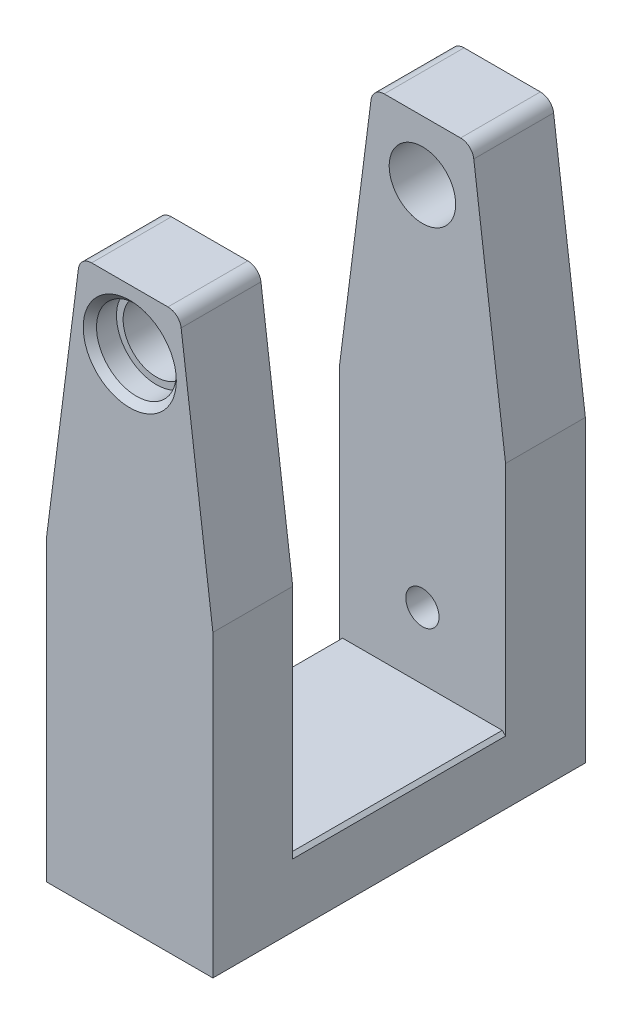
ISO-10303-21;
HEADER;
FILE_DESCRIPTION(('STEP AP214'),'2;1');
FILE_NAME('part.step','',(''),(''),'','','');
FILE_SCHEMA(('AUTOMOTIVE_DESIGN { 1 0 10303 214 1 1 1 1 }'));
ENDSEC;
DATA;
#1=APPLICATION_CONTEXT('core data for automotive mechanical design processes');
#2=APPLICATION_PROTOCOL_DEFINITION('international standard','automotive_design',2000,#1);
#3=PRODUCT_CONTEXT('',#1,'mechanical');
#4=PRODUCT('Part','Part','',(#3));
#5=PRODUCT_RELATED_PRODUCT_CATEGORY('part','',(#4));
#6=PRODUCT_DEFINITION_FORMATION('','',#4);
#7=PRODUCT_DEFINITION_CONTEXT('part definition',#1,'design');
#8=PRODUCT_DEFINITION('design','',#6,#7);
#9=PRODUCT_DEFINITION_SHAPE('','',#8);
#10=(LENGTH_UNIT() NAMED_UNIT(*) SI_UNIT(.MILLI.,.METRE.));
#11=(NAMED_UNIT(*) PLANE_ANGLE_UNIT() SI_UNIT($,.RADIAN.));
#12=(NAMED_UNIT(*) SI_UNIT($,.STERADIAN.) SOLID_ANGLE_UNIT());
#13=UNCERTAINTY_MEASURE_WITH_UNIT(LENGTH_MEASURE(1.E-05),#10,'distance_accuracy_value','');
#14=(GEOMETRIC_REPRESENTATION_CONTEXT(3) GLOBAL_UNCERTAINTY_ASSIGNED_CONTEXT((#13)) GLOBAL_UNIT_ASSIGNED_CONTEXT((#10,
#11,#12)) REPRESENTATION_CONTEXT('',''));
#15=CARTESIAN_POINT('',(0.,0.,0.));
#16=DIRECTION('',(0.,0.,1.));
#17=DIRECTION('',(1.,0.,0.));
#18=AXIS2_PLACEMENT_3D('',#15,#16,#17);
#19=CARTESIAN_POINT('',(7.49999999999998,84.,28.));
#20=DIRECTION('',(-0.99188166468585,-0.127164315985366,0.));
#21=DIRECTION('',(0.127164315985366,-0.991881664685851,0.));
#22=AXIS2_PLACEMENT_3D('',#19,#20,#21);
#23=PLANE('',#22);
#24=DIRECTION('',(-0.127164315985366,0.991881664685851,0.));
#25=VECTOR('',#24,1.);
#26=CARTESIAN_POINT('',(7.49999999999998,84.,16.));
#27=LINE('',#26,#25);
#28=CARTESIAN_POINT('',(12.5,45.,16.));
#29=VERTEX_POINT('',#28);
#30=CARTESIAN_POINT('',(7.72380402154219,82.2543286319708,16.));
#31=VERTEX_POINT('',#30);
#32=EDGE_CURVE('E278',#29,#31,#27,.T.);
#33=ORIENTED_EDGE('',*,*,#32,.T.);
#34=DIRECTION('',(0.,0.,-1.));
#35=VECTOR('',#34,1.);
#36=CARTESIAN_POINT('',(7.72380402154219,82.2543286319708,28.));
#37=LINE('',#36,#35);
#38=CARTESIAN_POINT('',(7.72380402154219,82.2543286319708,28.));
#39=VERTEX_POINT('',#38);
#40=EDGE_CURVE('E232',#31,#39,#37,.F.);
#41=ORIENTED_EDGE('',*,*,#40,.T.);
#42=DIRECTION('',(-0.127164315985366,0.991881664685851,0.));
#43=VECTOR('',#42,1.);
#44=CARTESIAN_POINT('',(7.49999999999998,84.,28.));
#45=LINE('',#44,#43);
#46=CARTESIAN_POINT('',(12.5,45.,28.));
#47=VERTEX_POINT('',#46);
#48=EDGE_CURVE('E293',#47,#39,#45,.T.);
#49=ORIENTED_EDGE('',*,*,#48,.F.);
#50=DIRECTION('',(0.,0.,-1.));
#51=VECTOR('',#50,1.);
#52=CARTESIAN_POINT('',(12.5,45.,28.));
#53=LINE('',#52,#51);
#54=EDGE_CURVE('E181',#47,#29,#53,.T.);
#55=ORIENTED_EDGE('',*,*,#54,.T.);
#56=EDGE_LOOP('',(#33,#41,#49,#55));
#57=FACE_BOUND('',#56,.T.);
#58=ADVANCED_FACE('F34',(#57),#23,.F.);
#59=CARTESIAN_POINT('',(7.49999999999998,84.,28.));
#60=DIRECTION('',(0.,-1.,0.));
#61=DIRECTION('',(0.,0.,-1.));
#62=AXIS2_PLACEMENT_3D('',#59,#60,#61);
#63=PLANE('',#62);
#64=DIRECTION('',(-1.,0.,0.));
#65=VECTOR('',#64,1.);
#66=CARTESIAN_POINT('',(7.49999999999998,84.,28.));
#67=LINE('',#66,#65);
#68=CARTESIAN_POINT('',(5.74004069217049,84.,28.));
#69=VERTEX_POINT('',#68);
#70=CARTESIAN_POINT('',(-5.74004069217054,84.,28.));
#71=VERTEX_POINT('',#70);
#72=EDGE_CURVE('E296',#69,#71,#67,.T.);
#73=ORIENTED_EDGE('',*,*,#72,.F.);
#74=DIRECTION('',(0.,0.,-1.));
#75=VECTOR('',#74,1.);
#76=CARTESIAN_POINT('',(5.74004069217049,84.,28.));
#77=LINE('',#76,#75);
#78=CARTESIAN_POINT('',(5.74004069217049,84.,16.));
#79=VERTEX_POINT('',#78);
#80=EDGE_CURVE('E225',#69,#79,#77,.T.);
#81=ORIENTED_EDGE('',*,*,#80,.T.);
#82=DIRECTION('',(1.,0.,0.));
#83=VECTOR('',#82,1.);
#84=CARTESIAN_POINT('',(-43.5,84.,16.));
#85=LINE('',#84,#83);
#86=CARTESIAN_POINT('',(-5.74004069217053,84.,16.));
#87=VERTEX_POINT('',#86);
#88=EDGE_CURVE('E330',#87,#79,#85,.T.);
#89=ORIENTED_EDGE('',*,*,#88,.F.);
#90=DIRECTION('',(0.,0.,-1.));
#91=VECTOR('',#90,1.);
#92=CARTESIAN_POINT('',(-5.74004069217054,84.,28.));
#93=LINE('',#92,#91);
#94=EDGE_CURVE('E223',#87,#71,#93,.F.);
#95=ORIENTED_EDGE('',*,*,#94,.T.);
#96=EDGE_LOOP('',(#73,#81,#89,#95));
#97=FACE_BOUND('',#96,.T.);
#98=ADVANCED_FACE('F335',(#97),#63,.F.);
#99=CARTESIAN_POINT('',(-7.50000000000002,84.,28.));
#100=DIRECTION('',(0.991881664685851,-0.127164315985365,0.));
#101=DIRECTION('',(0.127164315985365,0.991881664685851,0.));
#102=AXIS2_PLACEMENT_3D('',#99,#100,#101);
#103=PLANE('',#102);
#104=DIRECTION('',(-0.127164315985365,-0.991881664685851,0.));
#105=VECTOR('',#104,1.);
#106=CARTESIAN_POINT('',(-7.50000000000002,84.,28.));
#107=LINE('',#106,#105);
#108=CARTESIAN_POINT('',(-7.72380402154224,82.2543286319707,28.));
#109=VERTEX_POINT('',#108);
#110=CARTESIAN_POINT('',(-12.5,45.,28.));
#111=VERTEX_POINT('',#110);
#112=EDGE_CURVE('E299',#109,#111,#107,.T.);
#113=ORIENTED_EDGE('',*,*,#112,.F.);
#114=DIRECTION('',(0.,0.,-1.));
#115=VECTOR('',#114,1.);
#116=CARTESIAN_POINT('',(-7.72380402154224,82.2543286319707,28.));
#117=LINE('',#116,#115);
#118=CARTESIAN_POINT('',(-7.72380402154224,82.2543286319707,16.));
#119=VERTEX_POINT('',#118);
#120=EDGE_CURVE('E238',#109,#119,#117,.T.);
#121=ORIENTED_EDGE('',*,*,#120,.T.);
#122=DIRECTION('',(-0.127164315985365,-0.991881664685851,0.));
#123=VECTOR('',#122,1.);
#124=CARTESIAN_POINT('',(-7.50000000000002,84.,16.));
#125=LINE('',#124,#123);
#126=CARTESIAN_POINT('',(-12.5,45.,16.));
#127=VERTEX_POINT('',#126);
#128=EDGE_CURVE('E198',#119,#127,#125,.T.);
#129=ORIENTED_EDGE('',*,*,#128,.T.);
#130=DIRECTION('',(0.,0.,-1.));
#131=VECTOR('',#130,1.);
#132=CARTESIAN_POINT('',(-12.5,45.,28.));
#133=LINE('',#132,#131);
#134=EDGE_CURVE('E182',#111,#127,#133,.T.);
#135=ORIENTED_EDGE('',*,*,#134,.F.);
#136=EDGE_LOOP('',(#113,#121,#129,#135));
#137=FACE_BOUND('',#136,.T.);
#138=ADVANCED_FACE('F328',(#137),#103,.F.);
#139=CARTESIAN_POINT('',(-12.5,0.,28.));
#140=DIRECTION('',(1.,0.,0.));
#141=DIRECTION('',(0.,0.,-1.));
#142=AXIS2_PLACEMENT_3D('',#139,#140,#141);
#143=PLANE('',#142);
#144=DIRECTION('',(0.,0.,-1.));
#145=VECTOR('',#144,1.);
#146=CARTESIAN_POINT('',(-12.5,9.5,28.));
#147=LINE('',#146,#145);
#148=CARTESIAN_POINT('',(-12.5,9.5,16.));
#149=VERTEX_POINT('',#148);
#150=CARTESIAN_POINT('',(-12.5,9.5,-16.));
#151=VERTEX_POINT('',#150);
#152=EDGE_CURVE('E244',#149,#151,#147,.T.);
#153=ORIENTED_EDGE('',*,*,#152,.T.);
#154=DIRECTION('',(0.,1.,0.));
#155=VECTOR('',#154,1.);
#156=CARTESIAN_POINT('',(-12.5,0.,-16.));
#157=LINE('',#156,#155);
#158=CARTESIAN_POINT('',(-12.5,45.,-16.));
#159=VERTEX_POINT('',#158);
#160=EDGE_CURVE('E169',#151,#159,#157,.T.);
#161=ORIENTED_EDGE('',*,*,#160,.T.);
#162=CARTESIAN_POINT('',(-12.5,45.,-28.));
#163=VERTEX_POINT('',#162);
#164=EDGE_CURVE('E187',#159,#163,#133,.T.);
#165=ORIENTED_EDGE('',*,*,#164,.T.);
#166=DIRECTION('',(0.,-1.,0.));
#167=VECTOR('',#166,1.);
#168=CARTESIAN_POINT('',(-12.5,0.,-28.));
#169=LINE('',#168,#167);
#170=CARTESIAN_POINT('',(-12.5,0.,-28.));
#171=VERTEX_POINT('',#170);
#172=EDGE_CURVE('E281',#163,#171,#169,.T.);
#173=ORIENTED_EDGE('',*,*,#172,.T.);
#174=DIRECTION('',(0.,0.,-1.));
#175=VECTOR('',#174,1.);
#176=CARTESIAN_POINT('',(-12.5,0.,28.));
#177=LINE('',#176,#175);
#178=CARTESIAN_POINT('',(-12.5,0.,28.));
#179=VERTEX_POINT('',#178);
#180=EDGE_CURVE('E192',#179,#171,#177,.T.);
#181=ORIENTED_EDGE('',*,*,#180,.F.);
#182=DIRECTION('',(0.,-1.,0.));
#183=VECTOR('',#182,1.);
#184=CARTESIAN_POINT('',(-12.5,0.,28.));
#185=LINE('',#184,#183);
#186=EDGE_CURVE('E285',#111,#179,#185,.T.);
#187=ORIENTED_EDGE('',*,*,#186,.F.);
#188=ORIENTED_EDGE('',*,*,#134,.T.);
#189=DIRECTION('',(0.,-1.,0.));
#190=VECTOR('',#189,1.);
#191=CARTESIAN_POINT('',(-12.5,0.,16.));
#192=LINE('',#191,#190);
#193=EDGE_CURVE('E168',#127,#149,#192,.T.);
#194=ORIENTED_EDGE('',*,*,#193,.T.);
#195=EDGE_LOOP('',(#153,#161,#165,#173,#181,#187,#188,#194));
#196=FACE_BOUND('',#195,.T.);
#197=ADVANCED_FACE('F273',(#196),#143,.F.);
#198=CARTESIAN_POINT('',(12.5,0.,28.));
#199=DIRECTION('',(0.,1.,0.));
#200=DIRECTION('',(0.,0.,1.));
#201=AXIS2_PLACEMENT_3D('',#198,#199,#200);
#202=PLANE('',#201);
#203=DIRECTION('',(1.,0.,0.));
#204=VECTOR('',#203,1.);
#205=CARTESIAN_POINT('',(12.5,0.,-28.));
#206=LINE('',#205,#204);
#207=CARTESIAN_POINT('',(12.5,0.,-28.));
#208=VERTEX_POINT('',#207);
#209=EDGE_CURVE('E303',#171,#208,#206,.T.);
#210=ORIENTED_EDGE('',*,*,#209,.T.);
#211=DIRECTION('',(0.,0.,-1.));
#212=VECTOR('',#211,1.);
#213=CARTESIAN_POINT('',(12.5,0.,28.));
#214=LINE('',#213,#212);
#215=CARTESIAN_POINT('',(12.5,0.,28.));
#216=VERTEX_POINT('',#215);
#217=EDGE_CURVE('E185',#216,#208,#214,.T.);
#218=ORIENTED_EDGE('',*,*,#217,.F.);
#219=DIRECTION('',(1.,0.,0.));
#220=VECTOR('',#219,1.);
#221=CARTESIAN_POINT('',(12.5,0.,28.));
#222=LINE('',#221,#220);
#223=EDGE_CURVE('E288',#179,#216,#222,.T.);
#224=ORIENTED_EDGE('',*,*,#223,.F.);
#225=ORIENTED_EDGE('',*,*,#180,.T.);
#226=EDGE_LOOP('',(#210,#218,#224,#225));
#227=FACE_BOUND('',#226,.T.);
#228=ADVANCED_FACE('F321',(#227),#202,.F.);
#229=CARTESIAN_POINT('',(12.5,0.,28.));
#230=DIRECTION('',(-1.,0.,0.));
#231=DIRECTION('',(0.,0.,1.));
#232=AXIS2_PLACEMENT_3D('',#229,#230,#231);
#233=PLANE('',#232);
#234=DIRECTION('',(0.,1.,0.));
#235=VECTOR('',#234,1.);
#236=CARTESIAN_POINT('',(12.5,84.,-16.));
#237=LINE('',#236,#235);
#238=CARTESIAN_POINT('',(12.5,9.5,-16.));
#239=VERTEX_POINT('',#238);
#240=CARTESIAN_POINT('',(12.5,45.,-16.));
#241=VERTEX_POINT('',#240);
#242=EDGE_CURVE('E50',#239,#241,#237,.T.);
#243=ORIENTED_EDGE('',*,*,#242,.F.);
#244=DIRECTION('',(0.,0.,1.));
#245=VECTOR('',#244,1.);
#246=CARTESIAN_POINT('',(12.5,9.5,28.));
#247=LINE('',#246,#245);
#248=CARTESIAN_POINT('',(12.5,9.49999999999999,16.));
#249=VERTEX_POINT('',#248);
#250=EDGE_CURVE('E252',#239,#249,#247,.T.);
#251=ORIENTED_EDGE('',*,*,#250,.T.);
#252=DIRECTION('',(0.,-1.,0.));
#253=VECTOR('',#252,1.);
#254=CARTESIAN_POINT('',(12.5,84.,16.));
#255=LINE('',#254,#253);
#256=EDGE_CURVE('E57',#29,#249,#255,.T.);
#257=ORIENTED_EDGE('',*,*,#256,.F.);
#258=ORIENTED_EDGE('',*,*,#54,.F.);
#259=DIRECTION('',(0.,1.,0.));
#260=VECTOR('',#259,1.);
#261=CARTESIAN_POINT('',(12.5,0.,28.));
#262=LINE('',#261,#260);
#263=EDGE_CURVE('E291',#216,#47,#262,.T.);
#264=ORIENTED_EDGE('',*,*,#263,.F.);
#265=ORIENTED_EDGE('',*,*,#217,.T.);
#266=DIRECTION('',(0.,1.,0.));
#267=VECTOR('',#266,1.);
#268=CARTESIAN_POINT('',(12.5,0.,-28.));
#269=LINE('',#268,#267);
#270=CARTESIAN_POINT('',(12.5,45.,-28.));
#271=VERTEX_POINT('',#270);
#272=EDGE_CURVE('E179',#208,#271,#269,.T.);
#273=ORIENTED_EDGE('',*,*,#272,.T.);
#274=EDGE_CURVE('E162',#241,#271,#53,.T.);
#275=ORIENTED_EDGE('',*,*,#274,.F.);
#276=EDGE_LOOP('',(#243,#251,#257,#258,#264,#265,#273,#275));
#277=FACE_BOUND('',#276,.T.);
#278=ADVANCED_FACE('F176',(#277),#233,.F.);
#279=DIRECTION('',(-0.127164315985366,0.991881664685851,0.));
#280=VECTOR('',#279,1.);
#281=CARTESIAN_POINT('',(7.49999999999998,84.,-28.));
#282=LINE('',#281,#280);
#283=CARTESIAN_POINT('',(7.72380402154219,82.2543286319708,-28.));
#284=VERTEX_POINT('',#283);
#285=EDGE_CURVE('E306',#271,#284,#282,.T.);
#286=ORIENTED_EDGE('',*,*,#285,.T.);
#287=DIRECTION('',(0.,0.,-1.));
#288=VECTOR('',#287,1.);
#289=CARTESIAN_POINT('',(7.72380402154219,82.2543286319708,28.));
#290=LINE('',#289,#288);
#291=CARTESIAN_POINT('',(7.72380402154219,82.2543286319708,-16.));
#292=VERTEX_POINT('',#291);
#293=EDGE_CURVE('E165',#284,#292,#290,.F.);
#294=ORIENTED_EDGE('',*,*,#293,.T.);
#295=DIRECTION('',(0.127164315985366,-0.991881664685851,0.));
#296=VECTOR('',#295,1.);
#297=CARTESIAN_POINT('',(7.49999999999998,84.,-16.));
#298=LINE('',#297,#296);
#299=EDGE_CURVE('E159',#292,#241,#298,.T.);
#300=ORIENTED_EDGE('',*,*,#299,.T.);
#301=ORIENTED_EDGE('',*,*,#274,.T.);
#302=EDGE_LOOP('',(#286,#294,#300,#301));
#303=FACE_BOUND('',#302,.T.);
#304=ADVANCED_FACE('F161',(#303),#23,.F.);
#305=DIRECTION('',(1.,0.,0.));
#306=VECTOR('',#305,1.);
#307=CARTESIAN_POINT('',(-43.5,84.,-16.));
#308=LINE('',#307,#306);
#309=CARTESIAN_POINT('',(-5.74004069217053,84.,-16.));
#310=VERTEX_POINT('',#309);
#311=CARTESIAN_POINT('',(5.74004069217049,84.,-16.));
#312=VERTEX_POINT('',#311);
#313=EDGE_CURVE('E337',#310,#312,#308,.T.);
#314=ORIENTED_EDGE('',*,*,#313,.T.);
#315=DIRECTION('',(0.,0.,-1.));
#316=VECTOR('',#315,1.);
#317=CARTESIAN_POINT('',(5.74004069217049,84.,28.));
#318=LINE('',#317,#316);
#319=CARTESIAN_POINT('',(5.74004069217049,84.,-28.));
#320=VERTEX_POINT('',#319);
#321=EDGE_CURVE('E211',#312,#320,#318,.T.);
#322=ORIENTED_EDGE('',*,*,#321,.T.);
#323=DIRECTION('',(-1.,0.,0.));
#324=VECTOR('',#323,1.);
#325=CARTESIAN_POINT('',(7.49999999999998,84.,-28.));
#326=LINE('',#325,#324);
#327=CARTESIAN_POINT('',(-5.74004069217054,84.,-28.));
#328=VERTEX_POINT('',#327);
#329=EDGE_CURVE('E308',#320,#328,#326,.T.);
#330=ORIENTED_EDGE('',*,*,#329,.T.);
#331=DIRECTION('',(0.,0.,-1.));
#332=VECTOR('',#331,1.);
#333=CARTESIAN_POINT('',(-5.74004069217054,84.,28.));
#334=LINE('',#333,#332);
#335=EDGE_CURVE('E200',#328,#310,#334,.F.);
#336=ORIENTED_EDGE('',*,*,#335,.T.);
#337=EDGE_LOOP('',(#314,#322,#330,#336));
#338=FACE_BOUND('',#337,.T.);
#339=ADVANCED_FACE('F360',(#338),#63,.F.);
#340=DIRECTION('',(0.127164315985365,0.991881664685851,0.));
#341=VECTOR('',#340,1.);
#342=CARTESIAN_POINT('',(-7.50000000000002,84.,-16.));
#343=LINE('',#342,#341);
#344=CARTESIAN_POINT('',(-7.72380402154224,82.2543286319707,-16.));
#345=VERTEX_POINT('',#344);
#346=EDGE_CURVE('E195',#159,#345,#343,.T.);
#347=ORIENTED_EDGE('',*,*,#346,.T.);
#348=DIRECTION('',(0.,0.,-1.));
#349=VECTOR('',#348,1.);
#350=CARTESIAN_POINT('',(-7.72380402154224,82.2543286319707,28.));
#351=LINE('',#350,#349);
#352=CARTESIAN_POINT('',(-7.72380402154224,82.2543286319707,-28.));
#353=VERTEX_POINT('',#352);
#354=EDGE_CURVE('E241',#345,#353,#351,.T.);
#355=ORIENTED_EDGE('',*,*,#354,.T.);
#356=DIRECTION('',(-0.127164315985365,-0.991881664685851,0.));
#357=VECTOR('',#356,1.);
#358=CARTESIAN_POINT('',(-7.50000000000002,84.,-28.));
#359=LINE('',#358,#357);
#360=EDGE_CURVE('E289',#353,#163,#359,.T.);
#361=ORIENTED_EDGE('',*,*,#360,.T.);
#362=ORIENTED_EDGE('',*,*,#164,.F.);
#363=EDGE_LOOP('',(#347,#355,#361,#362));
#364=FACE_BOUND('',#363,.T.);
#365=ADVANCED_FACE('F312',(#364),#103,.F.);
#366=CARTESIAN_POINT('',(0.,0.,28.));
#367=DIRECTION('',(0.,0.,1.));
#368=DIRECTION('',(1.,0.,0.));
#369=AXIS2_PLACEMENT_3D('',#366,#367,#368);
#370=PLANE('',#369);
#371=CARTESIAN_POINT('',(0.,75.,28.));
#372=DIRECTION('',(0.,0.,1.));
#373=DIRECTION('',(1.,0.,0.));
#374=AXIS2_PLACEMENT_3D('',#371,#372,#373);
#375=CIRCLE('',#374,7.);
#376=CARTESIAN_POINT('',(7.,75.,28.));
#377=VERTEX_POINT('',#376);
#378=EDGE_CURVE('E424',#377,#377,#375,.T.);
#379=ORIENTED_EDGE('',*,*,#378,.F.);
#380=EDGE_LOOP('',(#379));
#381=FACE_BOUND('',#380,.T.);
#382=ORIENTED_EDGE('',*,*,#48,.T.);
#383=CARTESIAN_POINT('',(5.74004069217049,82.,28.));
#384=DIRECTION('',(0.,0.,1.));
#385=DIRECTION('',(1.,0.,0.));
#386=AXIS2_PLACEMENT_3D('',#383,#384,#385);
#387=CIRCLE('',#386,2.);
#388=EDGE_CURVE('E236',#39,#69,#387,.T.);
#389=ORIENTED_EDGE('',*,*,#388,.T.);
#390=ORIENTED_EDGE('',*,*,#72,.T.);
#391=CARTESIAN_POINT('',(-5.74004069217053,82.,28.));
#392=DIRECTION('',(0.,0.,1.));
#393=DIRECTION('',(1.,0.,0.));
#394=AXIS2_PLACEMENT_3D('',#391,#392,#393);
#395=CIRCLE('',#394,2.);
#396=EDGE_CURVE('E234',#71,#109,#395,.T.);
#397=ORIENTED_EDGE('',*,*,#396,.T.);
#398=ORIENTED_EDGE('',*,*,#112,.T.);
#399=ORIENTED_EDGE('',*,*,#186,.T.);
#400=ORIENTED_EDGE('',*,*,#223,.T.);
#401=ORIENTED_EDGE('',*,*,#263,.T.);
#402=EDGE_LOOP('',(#382,#389,#390,#397,#398,#399,#400,#401));
#403=FACE_BOUND('',#402,.T.);
#404=ADVANCED_FACE('F323',(#381,#403),#370,.T.);
#405=CARTESIAN_POINT('',(0.,0.,-28.));
#406=DIRECTION('',(0.,0.,1.));
#407=DIRECTION('',(1.,0.,0.));
#408=AXIS2_PLACEMENT_3D('',#405,#406,#407);
#409=PLANE('',#408);
#410=CARTESIAN_POINT('',(0.,20.,-28.));
#411=DIRECTION('',(0.,0.,-1.));
#412=DIRECTION('',(-1.,0.,0.));
#413=AXIS2_PLACEMENT_3D('',#410,#411,#412);
#414=CIRCLE('',#413,3.025);
#415=CARTESIAN_POINT('',(-3.025,20.,-28.));
#416=VERTEX_POINT('',#415);
#417=EDGE_CURVE('E430',#416,#416,#414,.T.);
#418=ORIENTED_EDGE('',*,*,#417,.F.);
#419=EDGE_LOOP('',(#418));
#420=FACE_BOUND('',#419,.T.);
#421=CARTESIAN_POINT('',(0.,75.,-28.));
#422=DIRECTION('',(0.,0.,-1.));
#423=DIRECTION('',(-1.,0.,0.));
#424=AXIS2_PLACEMENT_3D('',#421,#422,#423);
#425=CIRCLE('',#424,7.);
#426=CARTESIAN_POINT('',(-7.,75.,-28.));
#427=VERTEX_POINT('',#426);
#428=EDGE_CURVE('E208',#427,#427,#425,.T.);
#429=ORIENTED_EDGE('',*,*,#428,.F.);
#430=EDGE_LOOP('',(#429));
#431=FACE_BOUND('',#430,.T.);
#432=ORIENTED_EDGE('',*,*,#329,.F.);
#433=CARTESIAN_POINT('',(5.74004069217049,82.,-28.));
#434=DIRECTION('',(0.,0.,1.));
#435=DIRECTION('',(1.,0.,0.));
#436=AXIS2_PLACEMENT_3D('',#433,#434,#435);
#437=CIRCLE('',#436,2.);
#438=EDGE_CURVE('E216',#320,#284,#437,.F.);
#439=ORIENTED_EDGE('',*,*,#438,.T.);
#440=ORIENTED_EDGE('',*,*,#285,.F.);
#441=ORIENTED_EDGE('',*,*,#272,.F.);
#442=ORIENTED_EDGE('',*,*,#209,.F.);
#443=ORIENTED_EDGE('',*,*,#172,.F.);
#444=ORIENTED_EDGE('',*,*,#360,.F.);
#445=CARTESIAN_POINT('',(-5.74004069217053,82.,-28.));
#446=DIRECTION('',(0.,0.,1.));
#447=DIRECTION('',(1.,0.,0.));
#448=AXIS2_PLACEMENT_3D('',#445,#446,#447);
#449=CIRCLE('',#448,2.);
#450=EDGE_CURVE('E214',#353,#328,#449,.F.);
#451=ORIENTED_EDGE('',*,*,#450,.T.);
#452=EDGE_LOOP('',(#432,#439,#440,#441,#442,#443,#444,#451));
#453=FACE_BOUND('',#452,.T.);
#454=ADVANCED_FACE('F318',(#420,#431,#453),#409,.F.);
#455=CARTESIAN_POINT('',(-43.5,10.,16.));
#456=DIRECTION('',(0.,-1.,0.));
#457=DIRECTION('',(0.,0.,-1.));
#458=AXIS2_PLACEMENT_3D('',#455,#456,#457);
#459=PLANE('',#458);
#460=DIRECTION('',(1.,0.,0.));
#461=VECTOR('',#460,1.);
#462=CARTESIAN_POINT('',(-43.5,10.,-16.));
#463=LINE('',#462,#461);
#464=CARTESIAN_POINT('',(-12.,10.,-16.));
#465=VERTEX_POINT('',#464);
#466=CARTESIAN_POINT('',(12.,10.,-16.));
#467=VERTEX_POINT('',#466);
#468=EDGE_CURVE('E389',#465,#467,#463,.T.);
#469=ORIENTED_EDGE('',*,*,#468,.F.);
#470=DIRECTION('',(0.,0.,1.));
#471=VECTOR('',#470,1.);
#472=CARTESIAN_POINT('',(-12.,10.,16.));
#473=LINE('',#472,#471);
#474=CARTESIAN_POINT('',(-12.,10.,16.));
#475=VERTEX_POINT('',#474);
#476=EDGE_CURVE('E250',#465,#475,#473,.T.);
#477=ORIENTED_EDGE('',*,*,#476,.T.);
#478=DIRECTION('',(1.,0.,0.));
#479=VECTOR('',#478,1.);
#480=CARTESIAN_POINT('',(-43.5,10.,16.));
#481=LINE('',#480,#479);
#482=CARTESIAN_POINT('',(12.,10.,16.));
#483=VERTEX_POINT('',#482);
#484=EDGE_CURVE('E174',#475,#483,#481,.T.);
#485=ORIENTED_EDGE('',*,*,#484,.T.);
#486=DIRECTION('',(0.,0.,-1.));
#487=VECTOR('',#486,1.);
#488=CARTESIAN_POINT('',(12.,10.,16.));
#489=LINE('',#488,#487);
#490=EDGE_CURVE('E247',#483,#467,#489,.T.);
#491=ORIENTED_EDGE('',*,*,#490,.T.);
#492=EDGE_LOOP('',(#469,#477,#485,#491));
#493=FACE_BOUND('',#492,.T.);
#494=ADVANCED_FACE('F396',(#493),#459,.F.);
#495=CARTESIAN_POINT('',(-43.5,84.,16.));
#496=DIRECTION('',(0.,0.,1.));
#497=DIRECTION('',(0.,-1.,0.));
#498=AXIS2_PLACEMENT_3D('',#495,#496,#497);
#499=PLANE('',#498);
#500=CARTESIAN_POINT('',(0.,75.,16.));
#501=DIRECTION('',(0.,0.,1.));
#502=DIRECTION('',(0.,-1.,0.));
#503=AXIS2_PLACEMENT_3D('',#500,#501,#502);
#504=CIRCLE('',#503,5.);
#505=CARTESIAN_POINT('',(0.,70.,16.));
#506=VERTEX_POINT('',#505);
#507=EDGE_CURVE('E205',#506,#506,#504,.T.);
#508=ORIENTED_EDGE('',*,*,#507,.T.);
#509=EDGE_LOOP('',(#508));
#510=FACE_BOUND('',#509,.T.);
#511=ORIENTED_EDGE('',*,*,#88,.T.);
#512=CARTESIAN_POINT('',(5.74004069217049,82.,16.));
#513=DIRECTION('',(0.,0.,1.));
#514=DIRECTION('',(0.,-1.,0.));
#515=AXIS2_PLACEMENT_3D('',#512,#513,#514);
#516=CIRCLE('',#515,2.);
#517=EDGE_CURVE('E230',#79,#31,#516,.F.);
#518=ORIENTED_EDGE('',*,*,#517,.T.);
#519=ORIENTED_EDGE('',*,*,#32,.F.);
#520=ORIENTED_EDGE('',*,*,#256,.T.);
#521=DIRECTION('',(0.707106781186546,-0.707106781186549,0.));
#522=VECTOR('',#521,1.);
#523=CARTESIAN_POINT('',(-52.7499999999999,74.7500000000002,16.));
#524=LINE('',#523,#522);
#525=EDGE_CURVE('E11',#249,#483,#524,.F.);
#526=ORIENTED_EDGE('',*,*,#525,.T.);
#527=ORIENTED_EDGE('',*,*,#484,.F.);
#528=DIRECTION('',(0.707106781186546,0.707106781186549,0.));
#529=VECTOR('',#528,1.);
#530=CARTESIAN_POINT('',(9.25000000000007,31.2500000000001,16.));
#531=LINE('',#530,#529);
#532=EDGE_CURVE('E256',#475,#149,#531,.F.);
#533=ORIENTED_EDGE('',*,*,#532,.T.);
#534=ORIENTED_EDGE('',*,*,#193,.F.);
#535=ORIENTED_EDGE('',*,*,#128,.F.);
#536=CARTESIAN_POINT('',(-5.74004069217053,82.,16.));
#537=DIRECTION('',(0.,0.,1.));
#538=DIRECTION('',(0.,-1.,0.));
#539=AXIS2_PLACEMENT_3D('',#536,#537,#538);
#540=CIRCLE('',#539,2.);
#541=EDGE_CURVE('E228',#119,#87,#540,.F.);
#542=ORIENTED_EDGE('',*,*,#541,.T.);
#543=EDGE_LOOP('',(#511,#518,#519,#520,#526,#527,#533,#534,#535,#542));
#544=FACE_BOUND('',#543,.T.);
#545=ADVANCED_FACE('F264',(#510,#544),#499,.F.);
#546=CARTESIAN_POINT('',(-43.5,84.,-16.));
#547=DIRECTION('',(0.,0.,-1.));
#548=DIRECTION('',(0.,1.,0.));
#549=AXIS2_PLACEMENT_3D('',#546,#547,#548);
#550=PLANE('',#549);
#551=CARTESIAN_POINT('',(0.,20.,-16.));
#552=DIRECTION('',(0.,0.,-1.));
#553=DIRECTION('',(0.,1.,0.));
#554=AXIS2_PLACEMENT_3D('',#551,#552,#553);
#555=CIRCLE('',#554,2.49999999999999);
#556=CARTESIAN_POINT('',(0.,22.5,-16.));
#557=VERTEX_POINT('',#556);
#558=EDGE_CURVE('E38',#557,#557,#555,.T.);
#559=ORIENTED_EDGE('',*,*,#558,.T.);
#560=EDGE_LOOP('',(#559));
#561=FACE_BOUND('',#560,.T.);
#562=CARTESIAN_POINT('',(0.,75.,-16.));
#563=DIRECTION('',(0.,0.,-1.));
#564=DIRECTION('',(0.,1.,0.));
#565=AXIS2_PLACEMENT_3D('',#562,#563,#564);
#566=CIRCLE('',#565,5.);
#567=CARTESIAN_POINT('',(0.,80.,-16.));
#568=VERTEX_POINT('',#567);
#569=EDGE_CURVE('E201',#568,#568,#566,.T.);
#570=ORIENTED_EDGE('',*,*,#569,.T.);
#571=EDGE_LOOP('',(#570));
#572=FACE_BOUND('',#571,.T.);
#573=ORIENTED_EDGE('',*,*,#299,.F.);
#574=CARTESIAN_POINT('',(5.74004069217049,82.,-16.));
#575=DIRECTION('',(0.,0.,-1.));
#576=DIRECTION('',(0.,1.,0.));
#577=AXIS2_PLACEMENT_3D('',#574,#575,#576);
#578=CIRCLE('',#577,2.);
#579=EDGE_CURVE('E221',#292,#312,#578,.F.);
#580=ORIENTED_EDGE('',*,*,#579,.T.);
#581=ORIENTED_EDGE('',*,*,#313,.F.);
#582=CARTESIAN_POINT('',(-5.74004069217053,82.,-16.));
#583=DIRECTION('',(0.,0.,-1.));
#584=DIRECTION('',(0.,1.,0.));
#585=AXIS2_PLACEMENT_3D('',#582,#583,#584);
#586=CIRCLE('',#585,2.);
#587=EDGE_CURVE('E219',#310,#345,#586,.F.);
#588=ORIENTED_EDGE('',*,*,#587,.T.);
#589=ORIENTED_EDGE('',*,*,#346,.F.);
#590=ORIENTED_EDGE('',*,*,#160,.F.);
#591=DIRECTION('',(-0.707106781186546,-0.707106781186549,0.));
#592=VECTOR('',#591,1.);
#593=CARTESIAN_POINT('',(9.25000000000007,31.2500000000001,-16.));
#594=LINE('',#593,#592);
#595=EDGE_CURVE('E254',#151,#465,#594,.F.);
#596=ORIENTED_EDGE('',*,*,#595,.T.);
#597=ORIENTED_EDGE('',*,*,#468,.T.);
#598=DIRECTION('',(-0.707106781186546,0.707106781186549,0.));
#599=VECTOR('',#598,1.);
#600=CARTESIAN_POINT('',(-52.7499999999999,74.7500000000002,-16.));
#601=LINE('',#600,#599);
#602=EDGE_CURVE('E43',#467,#239,#601,.F.);
#603=ORIENTED_EDGE('',*,*,#602,.T.);
#604=ORIENTED_EDGE('',*,*,#242,.T.);
#605=EDGE_LOOP('',(#573,#580,#581,#588,#589,#590,#596,#597,#603,#604));
#606=FACE_BOUND('',#605,.T.);
#607=ADVANCED_FACE('F171',(#561,#572,#606),#550,.F.);
#608=CARTESIAN_POINT('',(0.,75.,-28.));
#609=DIRECTION('',(0.,0.,-1.));
#610=DIRECTION('',(-1.,0.,0.));
#611=AXIS2_PLACEMENT_3D('',#608,#609,#610);
#612=CYLINDRICAL_SURFACE('',#611,5.);
#613=CARTESIAN_POINT('',(0.,75.,-24.));
#614=DIRECTION('',(0.,0.,-1.));
#615=DIRECTION('',(-1.,0.,0.));
#616=AXIS2_PLACEMENT_3D('',#613,#614,#615);
#617=CIRCLE('',#616,5.);
#618=CARTESIAN_POINT('',(-5.,75.,-24.));
#619=VERTEX_POINT('',#618);
#620=EDGE_CURVE('E204',#619,#619,#617,.T.);
#621=ORIENTED_EDGE('',*,*,#620,.T.);
#622=EDGE_LOOP('',(#621));
#623=FACE_BOUND('',#622,.T.);
#624=ORIENTED_EDGE('',*,*,#569,.F.);
#625=EDGE_LOOP('',(#624));
#626=FACE_BOUND('',#625,.T.);
#627=ADVANCED_FACE('F462',(#623,#626),#612,.F.);
#628=CARTESIAN_POINT('',(5.,75.,-24.));
#629=DIRECTION('',(0.,0.,1.));
#630=DIRECTION('',(1.,0.,0.));
#631=AXIS2_PLACEMENT_3D('',#628,#629,#630);
#632=PLANE('',#631);
#633=ORIENTED_EDGE('',*,*,#620,.F.);
#634=EDGE_LOOP('',(#633));
#635=FACE_BOUND('',#634,.T.);
#636=CARTESIAN_POINT('',(0.,75.,-24.));
#637=DIRECTION('',(0.,0.,-1.));
#638=DIRECTION('',(-1.,0.,0.));
#639=AXIS2_PLACEMENT_3D('',#636,#637,#638);
#640=CIRCLE('',#639,6.);
#641=CARTESIAN_POINT('',(-6.,75.,-24.));
#642=VERTEX_POINT('',#641);
#643=EDGE_CURVE('E408',#642,#642,#640,.T.);
#644=ORIENTED_EDGE('',*,*,#643,.T.);
#645=EDGE_LOOP('',(#644));
#646=FACE_BOUND('',#645,.T.);
#647=ADVANCED_FACE('F454',(#635,#646),#632,.F.);
#648=CARTESIAN_POINT('',(0.,75.,-28.));
#649=DIRECTION('',(0.,0.,-1.));
#650=DIRECTION('',(-1.,0.,0.));
#651=AXIS2_PLACEMENT_3D('',#648,#649,#650);
#652=CYLINDRICAL_SURFACE('',#651,6.);
#653=ORIENTED_EDGE('',*,*,#643,.F.);
#654=EDGE_LOOP('',(#653));
#655=FACE_BOUND('',#654,.T.);
#656=CARTESIAN_POINT('',(0.,75.,-27.));
#657=DIRECTION('',(0.,0.,-1.));
#658=DIRECTION('',(-1.,0.,0.));
#659=AXIS2_PLACEMENT_3D('',#656,#657,#658);
#660=CIRCLE('',#659,6.);
#661=CARTESIAN_POINT('',(-6.,75.,-27.));
#662=VERTEX_POINT('',#661);
#663=EDGE_CURVE('E411',#662,#662,#660,.T.);
#664=ORIENTED_EDGE('',*,*,#663,.T.);
#665=EDGE_LOOP('',(#664));
#666=FACE_BOUND('',#665,.T.);
#667=ADVANCED_FACE('F444',(#655,#666),#652,.F.);
#668=CARTESIAN_POINT('',(0.,75.,-28.));
#669=DIRECTION('',(0.,0.,-1.));
#670=DIRECTION('',(-1.,0.,0.));
#671=AXIS2_PLACEMENT_3D('',#668,#669,#670);
#672=CONICAL_SURFACE('',#671,7.,0.785398163397448);
#673=ORIENTED_EDGE('',*,*,#663,.F.);
#674=EDGE_LOOP('',(#673));
#675=FACE_BOUND('',#674,.T.);
#676=ORIENTED_EDGE('',*,*,#428,.T.);
#677=EDGE_LOOP('',(#676));
#678=FACE_BOUND('',#677,.T.);
#679=ADVANCED_FACE('F441',(#675,#678),#672,.F.);
#680=CARTESIAN_POINT('',(0.,75.,28.));
#681=DIRECTION('',(0.,0.,1.));
#682=DIRECTION('',(1.,0.,0.));
#683=AXIS2_PLACEMENT_3D('',#680,#681,#682);
#684=CYLINDRICAL_SURFACE('',#683,5.);
#685=CARTESIAN_POINT('',(0.,75.,24.));
#686=DIRECTION('',(0.,0.,1.));
#687=DIRECTION('',(1.,0.,0.));
#688=AXIS2_PLACEMENT_3D('',#685,#686,#687);
#689=CIRCLE('',#688,5.);
#690=CARTESIAN_POINT('',(5.,75.,24.));
#691=VERTEX_POINT('',#690);
#692=EDGE_CURVE('E209',#691,#691,#689,.T.);
#693=ORIENTED_EDGE('',*,*,#692,.T.);
#694=EDGE_LOOP('',(#693));
#695=FACE_BOUND('',#694,.T.);
#696=ORIENTED_EDGE('',*,*,#507,.F.);
#697=EDGE_LOOP('',(#696));
#698=FACE_BOUND('',#697,.T.);
#699=ADVANCED_FACE('F443',(#695,#698),#684,.F.);
#700=CARTESIAN_POINT('',(5.,75.,24.));
#701=DIRECTION('',(0.,0.,-1.));
#702=DIRECTION('',(-1.,0.,0.));
#703=AXIS2_PLACEMENT_3D('',#700,#701,#702);
#704=PLANE('',#703);
#705=ORIENTED_EDGE('',*,*,#692,.F.);
#706=EDGE_LOOP('',(#705));
#707=FACE_BOUND('',#706,.T.);
#708=CARTESIAN_POINT('',(0.,75.,24.));
#709=DIRECTION('',(0.,0.,1.));
#710=DIRECTION('',(1.,0.,0.));
#711=AXIS2_PLACEMENT_3D('',#708,#709,#710);
#712=CIRCLE('',#711,6.);
#713=CARTESIAN_POINT('',(6.,75.,24.));
#714=VERTEX_POINT('',#713);
#715=EDGE_CURVE('E418',#714,#714,#712,.T.);
#716=ORIENTED_EDGE('',*,*,#715,.T.);
#717=EDGE_LOOP('',(#716));
#718=FACE_BOUND('',#717,.T.);
#719=ADVANCED_FACE('F451',(#707,#718),#704,.F.);
#720=CARTESIAN_POINT('',(0.,75.,28.));
#721=DIRECTION('',(0.,0.,1.));
#722=DIRECTION('',(1.,0.,0.));
#723=AXIS2_PLACEMENT_3D('',#720,#721,#722);
#724=CYLINDRICAL_SURFACE('',#723,6.);
#725=ORIENTED_EDGE('',*,*,#715,.F.);
#726=EDGE_LOOP('',(#725));
#727=FACE_BOUND('',#726,.T.);
#728=CARTESIAN_POINT('',(0.,75.,27.));
#729=DIRECTION('',(0.,0.,1.));
#730=DIRECTION('',(1.,0.,0.));
#731=AXIS2_PLACEMENT_3D('',#728,#729,#730);
#732=CIRCLE('',#731,6.);
#733=CARTESIAN_POINT('',(6.,75.,27.));
#734=VERTEX_POINT('',#733);
#735=EDGE_CURVE('E421',#734,#734,#732,.T.);
#736=ORIENTED_EDGE('',*,*,#735,.T.);
#737=EDGE_LOOP('',(#736));
#738=FACE_BOUND('',#737,.T.);
#739=ADVANCED_FACE('F381',(#727,#738),#724,.F.);
#740=CARTESIAN_POINT('',(0.,75.,28.));
#741=DIRECTION('',(0.,0.,1.));
#742=DIRECTION('',(1.,0.,0.));
#743=AXIS2_PLACEMENT_3D('',#740,#741,#742);
#744=CONICAL_SURFACE('',#743,7.,0.785398163397448);
#745=ORIENTED_EDGE('',*,*,#735,.F.);
#746=EDGE_LOOP('',(#745));
#747=FACE_BOUND('',#746,.T.);
#748=ORIENTED_EDGE('',*,*,#378,.T.);
#749=EDGE_LOOP('',(#748));
#750=FACE_BOUND('',#749,.T.);
#751=ADVANCED_FACE('F376',(#747,#750),#744,.F.);
#752=CARTESIAN_POINT('',(5.74004069217049,82.,28.));
#753=DIRECTION('',(0.,0.,-1.));
#754=DIRECTION('',(-1.,0.,0.));
#755=AXIS2_PLACEMENT_3D('',#752,#753,#754);
#756=CYLINDRICAL_SURFACE('',#755,2.);
#757=ORIENTED_EDGE('',*,*,#579,.F.);
#758=ORIENTED_EDGE('',*,*,#293,.F.);
#759=ORIENTED_EDGE('',*,*,#438,.F.);
#760=ORIENTED_EDGE('',*,*,#321,.F.);
#761=EDGE_LOOP('',(#757,#758,#759,#760));
#762=FACE_BOUND('',#761,.T.);
#763=ADVANCED_FACE('F350',(#762),#756,.T.);
#764=CARTESIAN_POINT('',(5.74004069217049,82.,28.));
#765=DIRECTION('',(0.,0.,-1.));
#766=DIRECTION('',(-1.,0.,0.));
#767=AXIS2_PLACEMENT_3D('',#764,#765,#766);
#768=CYLINDRICAL_SURFACE('',#767,2.);
#769=ORIENTED_EDGE('',*,*,#388,.F.);
#770=ORIENTED_EDGE('',*,*,#40,.F.);
#771=ORIENTED_EDGE('',*,*,#517,.F.);
#772=ORIENTED_EDGE('',*,*,#80,.F.);
#773=EDGE_LOOP('',(#769,#770,#771,#772));
#774=FACE_BOUND('',#773,.T.);
#775=ADVANCED_FACE('F342',(#774),#768,.T.);
#776=CARTESIAN_POINT('',(-5.74004069217053,82.,28.));
#777=DIRECTION('',(0.,0.,-1.));
#778=DIRECTION('',(-1.,0.,0.));
#779=AXIS2_PLACEMENT_3D('',#776,#777,#778);
#780=CYLINDRICAL_SURFACE('',#779,2.);
#781=ORIENTED_EDGE('',*,*,#396,.F.);
#782=ORIENTED_EDGE('',*,*,#94,.F.);
#783=ORIENTED_EDGE('',*,*,#541,.F.);
#784=ORIENTED_EDGE('',*,*,#120,.F.);
#785=EDGE_LOOP('',(#781,#782,#783,#784));
#786=FACE_BOUND('',#785,.T.);
#787=ADVANCED_FACE('F339',(#786),#780,.T.);
#788=CARTESIAN_POINT('',(-5.74004069217053,82.,28.));
#789=DIRECTION('',(0.,0.,-1.));
#790=DIRECTION('',(-1.,0.,0.));
#791=AXIS2_PLACEMENT_3D('',#788,#789,#790);
#792=CYLINDRICAL_SURFACE('',#791,2.);
#793=ORIENTED_EDGE('',*,*,#587,.F.);
#794=ORIENTED_EDGE('',*,*,#335,.F.);
#795=ORIENTED_EDGE('',*,*,#450,.F.);
#796=ORIENTED_EDGE('',*,*,#354,.F.);
#797=EDGE_LOOP('',(#793,#794,#795,#796));
#798=FACE_BOUND('',#797,.T.);
#799=ADVANCED_FACE('F341',(#798),#792,.T.);
#800=CARTESIAN_POINT('',(-12.5,9.5,28.));
#801=DIRECTION('',(0.707106781186549,-0.707106781186546,0.));
#802=DIRECTION('',(0.,0.,-1.));
#803=AXIS2_PLACEMENT_3D('',#800,#801,#802);
#804=PLANE('',#803);
#805=ORIENTED_EDGE('',*,*,#532,.F.);
#806=ORIENTED_EDGE('',*,*,#476,.F.);
#807=ORIENTED_EDGE('',*,*,#595,.F.);
#808=ORIENTED_EDGE('',*,*,#152,.F.);
#809=EDGE_LOOP('',(#805,#806,#807,#808));
#810=FACE_BOUND('',#809,.T.);
#811=ADVANCED_FACE('F270',(#810),#804,.F.);
#812=CARTESIAN_POINT('',(12.,10.,16.));
#813=DIRECTION('',(-0.707106781186549,-0.707106781186546,0.));
#814=DIRECTION('',(0.,0.,-1.));
#815=AXIS2_PLACEMENT_3D('',#812,#813,#814);
#816=PLANE('',#815);
#817=ORIENTED_EDGE('',*,*,#525,.F.);
#818=ORIENTED_EDGE('',*,*,#250,.F.);
#819=ORIENTED_EDGE('',*,*,#602,.F.);
#820=ORIENTED_EDGE('',*,*,#490,.F.);
#821=EDGE_LOOP('',(#817,#818,#819,#820));
#822=FACE_BOUND('',#821,.T.);
#823=ADVANCED_FACE('F36',(#822),#816,.F.);
#824=CARTESIAN_POINT('',(0.,20.,-28.));
#825=DIRECTION('',(0.,0.,-1.));
#826=DIRECTION('',(-1.,0.,0.));
#827=AXIS2_PLACEMENT_3D('',#824,#825,#826);
#828=CYLINDRICAL_SURFACE('',#827,2.49999999999999);
#829=CARTESIAN_POINT('',(0.,20.,-27.475));
#830=DIRECTION('',(0.,0.,-1.));
#831=DIRECTION('',(-1.,0.,0.));
#832=AXIS2_PLACEMENT_3D('',#829,#830,#831);
#833=CIRCLE('',#832,2.49999999999999);
#834=CARTESIAN_POINT('',(-2.49999999999999,20.,-27.475));
#835=VERTEX_POINT('',#834);
#836=EDGE_CURVE('E427',#835,#835,#833,.T.);
#837=ORIENTED_EDGE('',*,*,#836,.T.);
#838=EDGE_LOOP('',(#837));
#839=FACE_BOUND('',#838,.T.);
#840=ORIENTED_EDGE('',*,*,#558,.F.);
#841=EDGE_LOOP('',(#840));
#842=FACE_BOUND('',#841,.T.);
#843=ADVANCED_FACE('F614',(#839,#842),#828,.F.);
#844=CARTESIAN_POINT('',(0.,20.,-28.));
#845=DIRECTION('',(0.,0.,-1.));
#846=DIRECTION('',(-1.,0.,0.));
#847=AXIS2_PLACEMENT_3D('',#844,#845,#846);
#848=CONICAL_SURFACE('',#847,3.025,0.785398163397443);
#849=ORIENTED_EDGE('',*,*,#836,.F.);
#850=EDGE_LOOP('',(#849));
#851=FACE_BOUND('',#850,.T.);
#852=ORIENTED_EDGE('',*,*,#417,.T.);
#853=EDGE_LOOP('',(#852));
#854=FACE_BOUND('',#853,.T.);
#855=ADVANCED_FACE('F434',(#851,#854),#848,.F.);
#856=CLOSED_SHELL('',(#58,#98,#138,#197,#228,#278,#304,#339,#365,#404,#454,#494,#545,#607,#627,
#647,#667,#679,#699,#719,#739,#751,#763,#775,#787,#799,#811,#823,#843,#855));
#857=MANIFOLD_SOLID_BREP('B2',#856);
#858=ADVANCED_BREP_SHAPE_REPRESENTATION('',(#18,#857),#14);
#859=SHAPE_DEFINITION_REPRESENTATION(#9,#858);
ENDSEC;
END-ISO-10303-21;
